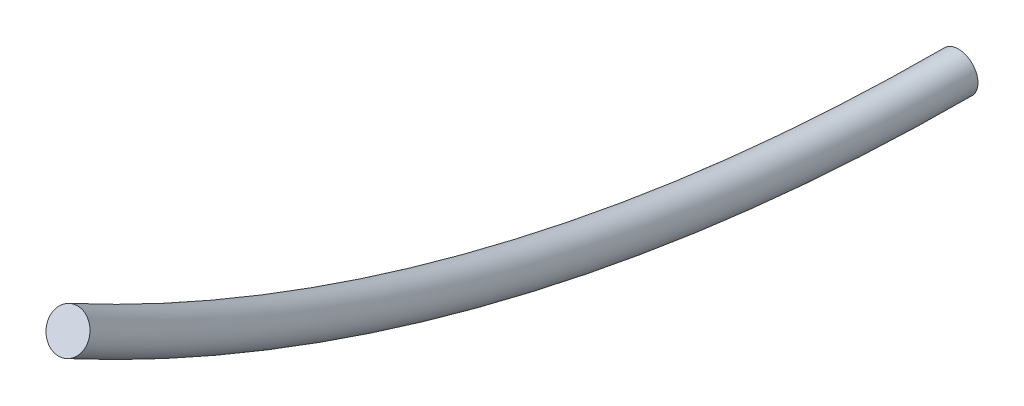
ISO-10303-21;
HEADER;
FILE_DESCRIPTION(('STEP AP214'),'2;1');
FILE_NAME('part.step','',(''),(''),'','','');
FILE_SCHEMA(('AUTOMOTIVE_DESIGN { 1 0 10303 214 1 1 1 1 }'));
ENDSEC;
DATA;
#1=APPLICATION_CONTEXT('core data for automotive mechanical design processes');
#2=APPLICATION_PROTOCOL_DEFINITION('international standard','automotive_design',2000,#1);
#3=PRODUCT_CONTEXT('',#1,'mechanical');
#4=PRODUCT('Part','Part','',(#3));
#5=PRODUCT_RELATED_PRODUCT_CATEGORY('part','',(#4));
#6=PRODUCT_DEFINITION_FORMATION('','',#4);
#7=PRODUCT_DEFINITION_CONTEXT('part definition',#1,'design');
#8=PRODUCT_DEFINITION('design','',#6,#7);
#9=PRODUCT_DEFINITION_SHAPE('','',#8);
#10=(LENGTH_UNIT() NAMED_UNIT(*) SI_UNIT(.MILLI.,.METRE.));
#11=(NAMED_UNIT(*) PLANE_ANGLE_UNIT() SI_UNIT($,.RADIAN.));
#12=(NAMED_UNIT(*) SI_UNIT($,.STERADIAN.) SOLID_ANGLE_UNIT());
#13=UNCERTAINTY_MEASURE_WITH_UNIT(LENGTH_MEASURE(1.E-05),#10,'distance_accuracy_value','');
#14=(GEOMETRIC_REPRESENTATION_CONTEXT(3) GLOBAL_UNCERTAINTY_ASSIGNED_CONTEXT((#13)) GLOBAL_UNIT_ASSIGNED_CONTEXT((#10,
#11,#12)) REPRESENTATION_CONTEXT('',''));
#15=CARTESIAN_POINT('',(0.,0.,0.));
#16=DIRECTION('',(0.,0.,1.));
#17=DIRECTION('',(1.,0.,0.));
#18=AXIS2_PLACEMENT_3D('',#15,#16,#17);
#19=CARTESIAN_POINT('',(2872.33263975703,-8372.09054602259,-8.76774208791176E-07));
#20=DIRECTION('',(0.9991412887452,-0.0414328990607721,0.));
#21=DIRECTION('',(0.0414328990607721,0.9991412887452,0.));
#22=AXIS2_PLACEMENT_3D('',#19,#20,#21);
#23=TOROIDAL_SURFACE('',#22,4866.26086899705,50.7999999932054);
#24=CARTESIAN_POINT('',(2695.49632997156,-12636.4423645339,2337.63284724809));
#25=DIRECTION('',(-0.0199033525832051,-0.47996306802392,-0.877062888217837));
#26=DIRECTION('',(-0.00508926697648567,0.877273932528893,-0.47996306802392));
#27=AXIS2_PLACEMENT_3D('',#24,#25,#26);
#28=CIRCLE('',#27,50.7999999932054);
#29=CARTESIAN_POINT('',(2693.65029565943,-12680.9588995458,2362.03592629907));
#30=VERTEX_POINT('',#29);
#31=EDGE_CURVE('E10',#30,#30,#28,.T.);
#32=CARTESIAN_POINT('',(2670.70934436849,-13234.1727020426,-8.76754576078353E-07));
#33=DIRECTION('',(0.,0.,-1.));
#34=DIRECTION('',(0.,1.,0.));
#35=AXIS2_PLACEMENT_3D('',#32,#33,#34);
#36=CIRCLE('',#35,50.7999999932054);
#37=CARTESIAN_POINT('',(2668.60455309649,-13284.9290795041,-8.76754371128015E-07));
#38=VERTEX_POINT('',#37);
#39=EDGE_CURVE('E39',#38,#38,#36,.T.);
#40=CARTESIAN_POINT('',(2872.33263975703,-8372.09054602259,-8.76774208791176E-07));
#41=DIRECTION('',(0.9991412887452,-0.0414328990607721,0.));
#42=DIRECTION('',(0.0414328990607721,0.9991412887452,0.));
#43=AXIS2_PLACEMENT_3D('',#40,#41,#42);
#44=CIRCLE('',#43,4917.06086899026);
#45=EDGE_CURVE('',#30,#38,#44,.T.);
#46=ORIENTED_EDGE('',*,*,#31,.T.);
#47=ORIENTED_EDGE('',*,*,#39,.F.);
#48=ORIENTED_EDGE('',*,*,#45,.T.);
#49=ORIENTED_EDGE('',*,*,#45,.F.);
#50=EDGE_LOOP('',(#46,#48,#47,#49));
#51=FACE_BOUND('',#50,.T.);
#52=ADVANCED_FACE('F33',(#51),#23,.T.);
#53=CARTESIAN_POINT('',(2695.49632997156,-12636.4423645339,2337.63284724809));
#54=DIRECTION('',(-0.0199033525832051,-0.47996306802392,-0.877062888217837));
#55=DIRECTION('',(-0.00508926697648567,0.877273932528893,-0.47996306802392));
#56=AXIS2_PLACEMENT_3D('',#53,#54,#55);
#57=PLANE('',#56);
#58=ORIENTED_EDGE('',*,*,#31,.F.);
#59=EDGE_LOOP('',(#58));
#60=FACE_BOUND('',#59,.T.);
#61=ADVANCED_FACE('F48',(#60),#57,.F.);
#62=CARTESIAN_POINT('',(2670.70934436849,-13234.1727020426,-8.76754576078353E-07));
#63=DIRECTION('',(0.,0.,-1.));
#64=DIRECTION('',(0.,1.,0.));
#65=AXIS2_PLACEMENT_3D('',#62,#63,#64);
#66=PLANE('',#65);
#67=ORIENTED_EDGE('',*,*,#39,.T.);
#68=EDGE_LOOP('',(#67));
#69=FACE_BOUND('',#68,.T.);
#70=ADVANCED_FACE('F45',(#69),#66,.T.);
#71=CLOSED_SHELL('',(#52,#61,#70));
#72=MANIFOLD_SOLID_BREP('B2',#71);
#73=ADVANCED_BREP_SHAPE_REPRESENTATION('',(#18,#72),#14);
#74=SHAPE_DEFINITION_REPRESENTATION(#9,#73);
ENDSEC;
END-ISO-10303-21;
